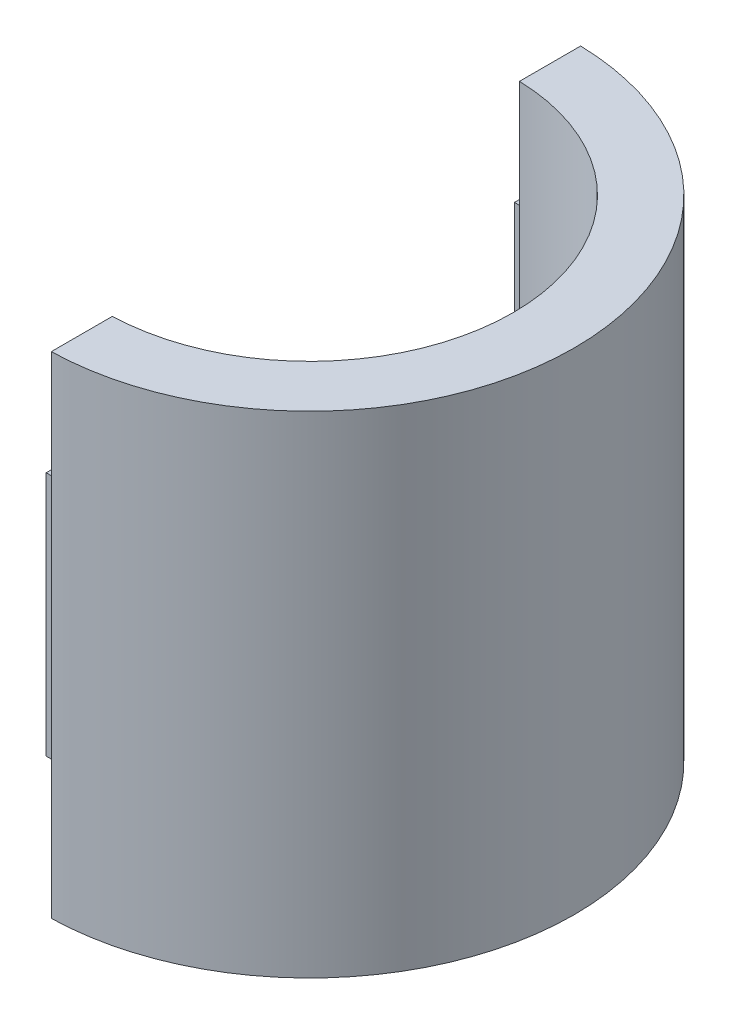
ISO-10303-21;
HEADER;
FILE_DESCRIPTION(('STEP AP214'),'2;1');
FILE_NAME('part.step','',(''),(''),'','','');
FILE_SCHEMA(('AUTOMOTIVE_DESIGN { 1 0 10303 214 1 1 1 1 }'));
ENDSEC;
DATA;
#1=APPLICATION_CONTEXT('core data for automotive mechanical design processes');
#2=APPLICATION_PROTOCOL_DEFINITION('international standard','automotive_design',2000,#1);
#3=PRODUCT_CONTEXT('',#1,'mechanical');
#4=PRODUCT('Part','Part','',(#3));
#5=PRODUCT_RELATED_PRODUCT_CATEGORY('part','',(#4));
#6=PRODUCT_DEFINITION_FORMATION('','',#4);
#7=PRODUCT_DEFINITION_CONTEXT('part definition',#1,'design');
#8=PRODUCT_DEFINITION('design','',#6,#7);
#9=PRODUCT_DEFINITION_SHAPE('','',#8);
#10=(LENGTH_UNIT() NAMED_UNIT(*) SI_UNIT(.MILLI.,.METRE.));
#11=(NAMED_UNIT(*) PLANE_ANGLE_UNIT() SI_UNIT($,.RADIAN.));
#12=(NAMED_UNIT(*) SI_UNIT($,.STERADIAN.) SOLID_ANGLE_UNIT());
#13=UNCERTAINTY_MEASURE_WITH_UNIT(LENGTH_MEASURE(1.E-05),#10,'distance_accuracy_value','');
#14=(GEOMETRIC_REPRESENTATION_CONTEXT(3) GLOBAL_UNCERTAINTY_ASSIGNED_CONTEXT((#13)) GLOBAL_UNIT_ASSIGNED_CONTEXT((#10,
#11,#12)) REPRESENTATION_CONTEXT('',''));
#15=CARTESIAN_POINT('',(0.,0.,0.));
#16=DIRECTION('',(0.,0.,1.));
#17=DIRECTION('',(1.,0.,0.));
#18=AXIS2_PLACEMENT_3D('',#15,#16,#17);
#19=CARTESIAN_POINT('',(3.175,0.,0.));
#20=DIRECTION('',(1.,0.,0.));
#21=DIRECTION('',(0.,0.,-1.));
#22=AXIS2_PLACEMENT_3D('',#19,#20,#21);
#23=PLANE('',#22);
#24=DIRECTION('',(0.,0.,-1.));
#25=VECTOR('',#24,1.);
#26=CARTESIAN_POINT('',(3.175,241.01,0.));
#27=LINE('',#26,#25);
#28=CARTESIAN_POINT('',(3.175,241.01,129.961222581969));
#29=VERTEX_POINT('',#28);
#30=CARTESIAN_POINT('',(3.175,241.01,99.9495841662185));
#31=VERTEX_POINT('',#30);
#32=EDGE_CURVE('E55',#29,#31,#27,.T.);
#33=ORIENTED_EDGE('',*,*,#32,.T.);
#34=DIRECTION('',(0.,1.,0.));
#35=VECTOR('',#34,1.);
#36=CARTESIAN_POINT('',(3.175,0.,99.9495841662185));
#37=LINE('',#36,#35);
#38=CARTESIAN_POINT('',(3.175,0.,99.9495841662185));
#39=VERTEX_POINT('',#38);
#40=EDGE_CURVE('E243',#39,#31,#37,.T.);
#41=ORIENTED_EDGE('',*,*,#40,.F.);
#42=DIRECTION('',(0.,0.,-1.));
#43=VECTOR('',#42,1.);
#44=CARTESIAN_POINT('',(3.175,0.,0.));
#45=LINE('',#44,#43);
#46=CARTESIAN_POINT('',(3.175,0.,129.961222581969));
#47=VERTEX_POINT('',#46);
#48=EDGE_CURVE('E253',#47,#39,#45,.T.);
#49=ORIENTED_EDGE('',*,*,#48,.F.);
#50=DIRECTION('',(0.,-1.,0.));
#51=VECTOR('',#50,1.);
#52=CARTESIAN_POINT('',(3.175,241.01,129.961222581969));
#53=LINE('',#52,#51);
#54=EDGE_CURVE('E255',#29,#47,#53,.T.);
#55=ORIENTED_EDGE('',*,*,#54,.F.);
#56=EDGE_LOOP('',(#33,#41,#49,#55));
#57=FACE_BOUND('',#56,.T.);
#58=DIRECTION('',(0.,-1.,0.));
#59=VECTOR('',#58,1.);
#60=CARTESIAN_POINT('',(3.175,60.2525,107.452493770156));
#61=LINE('',#60,#59);
#62=CARTESIAN_POINT('',(3.175,180.7575,107.452493770156));
#63=VERTEX_POINT('',#62);
#64=CARTESIAN_POINT('',(3.175,60.2525,107.452493770156));
#65=VERTEX_POINT('',#64);
#66=EDGE_CURVE('E170',#63,#65,#61,.T.);
#67=ORIENTED_EDGE('',*,*,#66,.F.);
#68=DIRECTION('',(0.,0.,-1.));
#69=VECTOR('',#68,1.);
#70=CARTESIAN_POINT('',(3.175,180.7575,107.452493770156));
#71=LINE('',#70,#69);
#72=CARTESIAN_POINT('',(3.175,180.7575,122.458312978031));
#73=VERTEX_POINT('',#72);
#74=EDGE_CURVE('E152',#73,#63,#71,.T.);
#75=ORIENTED_EDGE('',*,*,#74,.F.);
#76=DIRECTION('',(0.,1.,0.));
#77=VECTOR('',#76,1.);
#78=CARTESIAN_POINT('',(3.175,60.2525,122.458312978031));
#79=LINE('',#78,#77);
#80=CARTESIAN_POINT('',(3.175,60.2525,122.458312978031));
#81=VERTEX_POINT('',#80);
#82=EDGE_CURVE('E68',#81,#73,#79,.T.);
#83=ORIENTED_EDGE('',*,*,#82,.F.);
#84=DIRECTION('',(0.,0.,1.));
#85=VECTOR('',#84,1.);
#86=CARTESIAN_POINT('',(3.175,60.2525,107.452493770156));
#87=LINE('',#86,#85);
#88=EDGE_CURVE('E63',#65,#81,#87,.T.);
#89=ORIENTED_EDGE('',*,*,#88,.F.);
#90=EDGE_LOOP('',(#67,#75,#83,#89));
#91=FACE_BOUND('',#90,.T.);
#92=ADVANCED_FACE('F45',(#57,#91),#23,.F.);
#93=DIRECTION('',(0.,0.,1.));
#94=VECTOR('',#93,1.);
#95=CARTESIAN_POINT('',(3.175,180.7575,-107.452493770156));
#96=LINE('',#95,#94);
#97=CARTESIAN_POINT('',(3.175,180.7575,-122.458312978031));
#98=VERTEX_POINT('',#97);
#99=CARTESIAN_POINT('',(3.175,180.7575,-107.452493770156));
#100=VERTEX_POINT('',#99);
#101=EDGE_CURVE('E191',#98,#100,#96,.T.);
#102=ORIENTED_EDGE('',*,*,#101,.T.);
#103=DIRECTION('',(0.,-1.,0.));
#104=VECTOR('',#103,1.);
#105=CARTESIAN_POINT('',(3.175,60.2525,-107.452493770156));
#106=LINE('',#105,#104);
#107=CARTESIAN_POINT('',(3.175,60.2525,-107.452493770156));
#108=VERTEX_POINT('',#107);
#109=EDGE_CURVE('E179',#100,#108,#106,.T.);
#110=ORIENTED_EDGE('',*,*,#109,.T.);
#111=DIRECTION('',(0.,0.,-1.));
#112=VECTOR('',#111,1.);
#113=CARTESIAN_POINT('',(3.175,60.2525,-107.452493770156));
#114=LINE('',#113,#112);
#115=CARTESIAN_POINT('',(3.175,60.2525,-122.458312978031));
#116=VERTEX_POINT('',#115);
#117=EDGE_CURVE('E207',#108,#116,#114,.T.);
#118=ORIENTED_EDGE('',*,*,#117,.T.);
#119=DIRECTION('',(0.,1.,0.));
#120=VECTOR('',#119,1.);
#121=CARTESIAN_POINT('',(3.175,60.2525,-122.458312978031));
#122=LINE('',#121,#120);
#123=EDGE_CURVE('E211',#116,#98,#122,.T.);
#124=ORIENTED_EDGE('',*,*,#123,.T.);
#125=EDGE_LOOP('',(#102,#110,#118,#124));
#126=FACE_BOUND('',#125,.T.);
#127=CARTESIAN_POINT('',(3.175,0.,-99.9495841662185));
#128=VERTEX_POINT('',#127);
#129=CARTESIAN_POINT('',(3.175,0.,-129.961222581969));
#130=VERTEX_POINT('',#129);
#131=EDGE_CURVE('E252',#128,#130,#45,.T.);
#132=ORIENTED_EDGE('',*,*,#131,.F.);
#133=DIRECTION('',(0.,1.,0.));
#134=VECTOR('',#133,1.);
#135=CARTESIAN_POINT('',(3.175,0.,-99.9495841662185));
#136=LINE('',#135,#134);
#137=CARTESIAN_POINT('',(3.175,241.01,-99.9495841662185));
#138=VERTEX_POINT('',#137);
#139=EDGE_CURVE('E249',#138,#128,#136,.F.);
#140=ORIENTED_EDGE('',*,*,#139,.F.);
#141=CARTESIAN_POINT('',(3.175,241.01,-129.961222581969));
#142=VERTEX_POINT('',#141);
#143=EDGE_CURVE('E11',#138,#142,#27,.T.);
#144=ORIENTED_EDGE('',*,*,#143,.T.);
#145=DIRECTION('',(0.,-1.,0.));
#146=VECTOR('',#145,1.);
#147=CARTESIAN_POINT('',(3.175,241.01,-129.961222581969));
#148=LINE('',#147,#146);
#149=EDGE_CURVE('E49',#130,#142,#148,.F.);
#150=ORIENTED_EDGE('',*,*,#149,.F.);
#151=EDGE_LOOP('',(#132,#140,#144,#150));
#152=FACE_BOUND('',#151,.T.);
#153=ADVANCED_FACE('F47',(#126,#152),#23,.F.);
#154=CARTESIAN_POINT('',(0.,241.01,0.));
#155=DIRECTION('',(0.,-1.,0.));
#156=DIRECTION('',(0.,0.,-1.));
#157=AXIS2_PLACEMENT_3D('',#154,#155,#156);
#158=CYLINDRICAL_SURFACE('',#157,130.);
#159=CARTESIAN_POINT('',(0.,241.01,0.));
#160=DIRECTION('',(0.,1.,0.));
#161=DIRECTION('',(0.,0.,1.));
#162=AXIS2_PLACEMENT_3D('',#159,#160,#161);
#163=CIRCLE('',#162,130.);
#164=EDGE_CURVE('E239',#29,#142,#163,.T.);
#165=ORIENTED_EDGE('',*,*,#164,.F.);
#166=ORIENTED_EDGE('',*,*,#54,.T.);
#167=CARTESIAN_POINT('',(0.,0.,0.));
#168=DIRECTION('',(0.,1.,0.));
#169=DIRECTION('',(0.,0.,1.));
#170=AXIS2_PLACEMENT_3D('',#167,#168,#169);
#171=CIRCLE('',#170,130.);
#172=EDGE_CURVE('E235',#47,#130,#171,.T.);
#173=ORIENTED_EDGE('',*,*,#172,.T.);
#174=ORIENTED_EDGE('',*,*,#149,.T.);
#175=EDGE_LOOP('',(#165,#166,#173,#174));
#176=FACE_BOUND('',#175,.T.);
#177=ADVANCED_FACE('F263',(#176),#158,.T.);
#178=CARTESIAN_POINT('',(0.,0.,0.));
#179=DIRECTION('',(0.,1.,0.));
#180=DIRECTION('',(0.,0.,1.));
#181=AXIS2_PLACEMENT_3D('',#178,#179,#180);
#182=PLANE('',#181);
#183=ORIENTED_EDGE('',*,*,#172,.F.);
#184=ORIENTED_EDGE('',*,*,#48,.T.);
#185=CARTESIAN_POINT('',(0.,0.,0.));
#186=DIRECTION('',(0.,1.,0.));
#187=DIRECTION('',(0.,0.,1.));
#188=AXIS2_PLACEMENT_3D('',#185,#186,#187);
#189=CIRCLE('',#188,100.);
#190=EDGE_CURVE('E231',#39,#128,#189,.T.);
#191=ORIENTED_EDGE('',*,*,#190,.T.);
#192=ORIENTED_EDGE('',*,*,#131,.T.);
#193=EDGE_LOOP('',(#183,#184,#191,#192));
#194=FACE_BOUND('',#193,.T.);
#195=ADVANCED_FACE('F277',(#194),#182,.F.);
#196=CARTESIAN_POINT('',(0.,241.01,0.));
#197=DIRECTION('',(0.,1.,0.));
#198=DIRECTION('',(0.,0.,1.));
#199=AXIS2_PLACEMENT_3D('',#196,#197,#198);
#200=PLANE('',#199);
#201=ORIENTED_EDGE('',*,*,#32,.F.);
#202=ORIENTED_EDGE('',*,*,#164,.T.);
#203=ORIENTED_EDGE('',*,*,#143,.F.);
#204=CARTESIAN_POINT('',(0.,241.01,0.));
#205=DIRECTION('',(0.,1.,0.));
#206=DIRECTION('',(0.,0.,1.));
#207=AXIS2_PLACEMENT_3D('',#204,#205,#206);
#208=CIRCLE('',#207,100.);
#209=EDGE_CURVE('E221',#31,#138,#208,.T.);
#210=ORIENTED_EDGE('',*,*,#209,.F.);
#211=EDGE_LOOP('',(#201,#202,#203,#210));
#212=FACE_BOUND('',#211,.T.);
#213=ADVANCED_FACE('F272',(#212),#200,.T.);
#214=CARTESIAN_POINT('',(0.,0.,0.));
#215=DIRECTION('',(0.,1.,0.));
#216=DIRECTION('',(0.,0.,1.));
#217=AXIS2_PLACEMENT_3D('',#214,#215,#216);
#218=CYLINDRICAL_SURFACE('',#217,100.);
#219=ORIENTED_EDGE('',*,*,#209,.T.);
#220=ORIENTED_EDGE('',*,*,#139,.T.);
#221=ORIENTED_EDGE('',*,*,#190,.F.);
#222=ORIENTED_EDGE('',*,*,#40,.T.);
#223=EDGE_LOOP('',(#219,#220,#221,#222));
#224=FACE_BOUND('',#223,.T.);
#225=ADVANCED_FACE('F280',(#224),#218,.F.);
#226=CARTESIAN_POINT('',(-6.825,60.2525,-107.452493770156));
#227=DIRECTION('',(0.,0.,1.));
#228=DIRECTION('',(1.,0.,0.));
#229=AXIS2_PLACEMENT_3D('',#226,#227,#228);
#230=PLANE('',#229);
#231=ORIENTED_EDGE('',*,*,#109,.F.);
#232=DIRECTION('',(1.,0.,0.));
#233=VECTOR('',#232,1.);
#234=CARTESIAN_POINT('',(-6.825,180.7575,-107.452493770156));
#235=LINE('',#234,#233);
#236=CARTESIAN_POINT('',(-6.825,180.7575,-107.452493770156));
#237=VERTEX_POINT('',#236);
#238=EDGE_CURVE('E218',#237,#100,#235,.T.);
#239=ORIENTED_EDGE('',*,*,#238,.F.);
#240=DIRECTION('',(0.,-1.,0.));
#241=VECTOR('',#240,1.);
#242=CARTESIAN_POINT('',(-6.825,60.2525,-107.452493770156));
#243=LINE('',#242,#241);
#244=CARTESIAN_POINT('',(-6.825,60.2525,-107.452493770156));
#245=VERTEX_POINT('',#244);
#246=EDGE_CURVE('E186',#237,#245,#243,.T.);
#247=ORIENTED_EDGE('',*,*,#246,.T.);
#248=DIRECTION('',(1.,0.,0.));
#249=VECTOR('',#248,1.);
#250=CARTESIAN_POINT('',(-6.825,60.2525,-107.452493770156));
#251=LINE('',#250,#249);
#252=EDGE_CURVE('E203',#245,#108,#251,.T.);
#253=ORIENTED_EDGE('',*,*,#252,.T.);
#254=EDGE_LOOP('',(#231,#239,#247,#253));
#255=FACE_BOUND('',#254,.T.);
#256=ADVANCED_FACE('F282',(#255),#230,.T.);
#257=CARTESIAN_POINT('',(-6.825,180.7575,-107.452493770156));
#258=DIRECTION('',(0.,1.,0.));
#259=DIRECTION('',(0.,0.,1.));
#260=AXIS2_PLACEMENT_3D('',#257,#258,#259);
#261=PLANE('',#260);
#262=ORIENTED_EDGE('',*,*,#101,.F.);
#263=DIRECTION('',(1.,0.,0.));
#264=VECTOR('',#263,1.);
#265=CARTESIAN_POINT('',(-6.825,180.7575,-122.458312978031));
#266=LINE('',#265,#264);
#267=CARTESIAN_POINT('',(-6.825,180.7575,-122.458312978031));
#268=VERTEX_POINT('',#267);
#269=EDGE_CURVE('E222',#268,#98,#266,.T.);
#270=ORIENTED_EDGE('',*,*,#269,.F.);
#271=DIRECTION('',(0.,0.,1.));
#272=VECTOR('',#271,1.);
#273=CARTESIAN_POINT('',(-6.825,180.7575,-107.452493770156));
#274=LINE('',#273,#272);
#275=EDGE_CURVE('E199',#268,#237,#274,.T.);
#276=ORIENTED_EDGE('',*,*,#275,.T.);
#277=ORIENTED_EDGE('',*,*,#238,.T.);
#278=EDGE_LOOP('',(#262,#270,#276,#277));
#279=FACE_BOUND('',#278,.T.);
#280=ADVANCED_FACE('F290',(#279),#261,.T.);
#281=CARTESIAN_POINT('',(-6.825,60.2525,-122.458312978031));
#282=DIRECTION('',(0.,0.,-1.));
#283=DIRECTION('',(-1.,0.,0.));
#284=AXIS2_PLACEMENT_3D('',#281,#282,#283);
#285=PLANE('',#284);
#286=ORIENTED_EDGE('',*,*,#123,.F.);
#287=DIRECTION('',(1.,0.,0.));
#288=VECTOR('',#287,1.);
#289=CARTESIAN_POINT('',(-6.825,60.2525,-122.458312978031));
#290=LINE('',#289,#288);
#291=CARTESIAN_POINT('',(-6.825,60.2525,-122.458312978031));
#292=VERTEX_POINT('',#291);
#293=EDGE_CURVE('E225',#292,#116,#290,.T.);
#294=ORIENTED_EDGE('',*,*,#293,.F.);
#295=DIRECTION('',(0.,1.,0.));
#296=VECTOR('',#295,1.);
#297=CARTESIAN_POINT('',(-6.825,60.2525,-122.458312978031));
#298=LINE('',#297,#296);
#299=EDGE_CURVE('E195',#292,#268,#298,.T.);
#300=ORIENTED_EDGE('',*,*,#299,.T.);
#301=ORIENTED_EDGE('',*,*,#269,.T.);
#302=EDGE_LOOP('',(#286,#294,#300,#301));
#303=FACE_BOUND('',#302,.T.);
#304=ADVANCED_FACE('F357',(#303),#285,.T.);
#305=CARTESIAN_POINT('',(-6.825,60.2525,-107.452493770156));
#306=DIRECTION('',(0.,-1.,0.));
#307=DIRECTION('',(0.,0.,-1.));
#308=AXIS2_PLACEMENT_3D('',#305,#306,#307);
#309=PLANE('',#308);
#310=ORIENTED_EDGE('',*,*,#117,.F.);
#311=ORIENTED_EDGE('',*,*,#252,.F.);
#312=DIRECTION('',(0.,0.,-1.));
#313=VECTOR('',#312,1.);
#314=CARTESIAN_POINT('',(-6.825,60.2525,-107.452493770156));
#315=LINE('',#314,#313);
#316=EDGE_CURVE('E190',#245,#292,#315,.T.);
#317=ORIENTED_EDGE('',*,*,#316,.T.);
#318=ORIENTED_EDGE('',*,*,#293,.T.);
#319=EDGE_LOOP('',(#310,#311,#317,#318));
#320=FACE_BOUND('',#319,.T.);
#321=ADVANCED_FACE('F353',(#320),#309,.T.);
#322=CARTESIAN_POINT('',(-6.825,0.,0.));
#323=DIRECTION('',(-1.,0.,0.));
#324=DIRECTION('',(0.,0.,1.));
#325=AXIS2_PLACEMENT_3D('',#322,#323,#324);
#326=PLANE('',#325);
#327=ORIENTED_EDGE('',*,*,#246,.F.);
#328=ORIENTED_EDGE('',*,*,#275,.F.);
#329=ORIENTED_EDGE('',*,*,#299,.F.);
#330=ORIENTED_EDGE('',*,*,#316,.F.);
#331=EDGE_LOOP('',(#327,#328,#329,#330));
#332=FACE_BOUND('',#331,.T.);
#333=ADVANCED_FACE('F305',(#332),#326,.T.);
#334=CARTESIAN_POINT('',(-6.825,60.2525,107.452493770156));
#335=DIRECTION('',(0.,0.,1.));
#336=DIRECTION('',(1.,0.,0.));
#337=AXIS2_PLACEMENT_3D('',#334,#335,#336);
#338=PLANE('',#337);
#339=ORIENTED_EDGE('',*,*,#66,.T.);
#340=DIRECTION('',(1.,0.,0.));
#341=VECTOR('',#340,1.);
#342=CARTESIAN_POINT('',(-6.825,60.2525,107.452493770156));
#343=LINE('',#342,#341);
#344=CARTESIAN_POINT('',(-6.825,60.2525,107.452493770156));
#345=VERTEX_POINT('',#344);
#346=EDGE_CURVE('E160',#345,#65,#343,.T.);
#347=ORIENTED_EDGE('',*,*,#346,.F.);
#348=DIRECTION('',(0.,-1.,0.));
#349=VECTOR('',#348,1.);
#350=CARTESIAN_POINT('',(-6.825,60.2525,107.452493770156));
#351=LINE('',#350,#349);
#352=CARTESIAN_POINT('',(-6.825,180.7575,107.452493770156));
#353=VERTEX_POINT('',#352);
#354=EDGE_CURVE('E139',#353,#345,#351,.T.);
#355=ORIENTED_EDGE('',*,*,#354,.F.);
#356=DIRECTION('',(1.,0.,0.));
#357=VECTOR('',#356,1.);
#358=CARTESIAN_POINT('',(-6.825,180.7575,107.452493770156));
#359=LINE('',#358,#357);
#360=EDGE_CURVE('E150',#353,#63,#359,.T.);
#361=ORIENTED_EDGE('',*,*,#360,.T.);
#362=EDGE_LOOP('',(#339,#347,#355,#361));
#363=FACE_BOUND('',#362,.T.);
#364=ADVANCED_FACE('F159',(#363),#338,.F.);
#365=CARTESIAN_POINT('',(-6.825,60.2525,107.452493770156));
#366=DIRECTION('',(0.,1.,0.));
#367=DIRECTION('',(0.,0.,1.));
#368=AXIS2_PLACEMENT_3D('',#365,#366,#367);
#369=PLANE('',#368);
#370=ORIENTED_EDGE('',*,*,#88,.T.);
#371=DIRECTION('',(1.,0.,0.));
#372=VECTOR('',#371,1.);
#373=CARTESIAN_POINT('',(-6.825,60.2525,122.458312978031));
#374=LINE('',#373,#372);
#375=CARTESIAN_POINT('',(-6.825,60.2525,122.458312978031));
#376=VERTEX_POINT('',#375);
#377=EDGE_CURVE('E180',#376,#81,#374,.T.);
#378=ORIENTED_EDGE('',*,*,#377,.F.);
#379=DIRECTION('',(0.,0.,1.));
#380=VECTOR('',#379,1.);
#381=CARTESIAN_POINT('',(-6.825,60.2525,107.452493770156));
#382=LINE('',#381,#380);
#383=EDGE_CURVE('E157',#345,#376,#382,.T.);
#384=ORIENTED_EDGE('',*,*,#383,.F.);
#385=ORIENTED_EDGE('',*,*,#346,.T.);
#386=EDGE_LOOP('',(#370,#378,#384,#385));
#387=FACE_BOUND('',#386,.T.);
#388=ADVANCED_FACE('F312',(#387),#369,.F.);
#389=CARTESIAN_POINT('',(-6.825,60.2525,122.458312978031));
#390=DIRECTION('',(0.,0.,-1.));
#391=DIRECTION('',(-1.,0.,0.));
#392=AXIS2_PLACEMENT_3D('',#389,#390,#391);
#393=PLANE('',#392);
#394=ORIENTED_EDGE('',*,*,#82,.T.);
#395=DIRECTION('',(1.,0.,0.));
#396=VECTOR('',#395,1.);
#397=CARTESIAN_POINT('',(-6.825,180.7575,122.458312978031));
#398=LINE('',#397,#396);
#399=CARTESIAN_POINT('',(-6.825,180.7575,122.458312978031));
#400=VERTEX_POINT('',#399);
#401=EDGE_CURVE('E156',#400,#73,#398,.T.);
#402=ORIENTED_EDGE('',*,*,#401,.F.);
#403=DIRECTION('',(0.,1.,0.));
#404=VECTOR('',#403,1.);
#405=CARTESIAN_POINT('',(-6.825,60.2525,122.458312978031));
#406=LINE('',#405,#404);
#407=EDGE_CURVE('E142',#376,#400,#406,.T.);
#408=ORIENTED_EDGE('',*,*,#407,.F.);
#409=ORIENTED_EDGE('',*,*,#377,.T.);
#410=EDGE_LOOP('',(#394,#402,#408,#409));
#411=FACE_BOUND('',#410,.T.);
#412=ADVANCED_FACE('F319',(#411),#393,.F.);
#413=CARTESIAN_POINT('',(-6.825,180.7575,107.452493770156));
#414=DIRECTION('',(0.,-1.,0.));
#415=DIRECTION('',(0.,0.,-1.));
#416=AXIS2_PLACEMENT_3D('',#413,#414,#415);
#417=PLANE('',#416);
#418=ORIENTED_EDGE('',*,*,#74,.T.);
#419=ORIENTED_EDGE('',*,*,#360,.F.);
#420=DIRECTION('',(0.,0.,-1.));
#421=VECTOR('',#420,1.);
#422=CARTESIAN_POINT('',(-6.825,180.7575,107.452493770156));
#423=LINE('',#422,#421);
#424=EDGE_CURVE('E135',#400,#353,#423,.T.);
#425=ORIENTED_EDGE('',*,*,#424,.F.);
#426=ORIENTED_EDGE('',*,*,#401,.T.);
#427=EDGE_LOOP('',(#418,#419,#425,#426));
#428=FACE_BOUND('',#427,.T.);
#429=ADVANCED_FACE('F151',(#428),#417,.F.);
#430=CARTESIAN_POINT('',(-6.825,0.,0.));
#431=DIRECTION('',(-1.,0.,0.));
#432=DIRECTION('',(0.,0.,-1.));
#433=AXIS2_PLACEMENT_3D('',#430,#431,#432);
#434=PLANE('',#433);
#435=ORIENTED_EDGE('',*,*,#354,.T.);
#436=ORIENTED_EDGE('',*,*,#383,.T.);
#437=ORIENTED_EDGE('',*,*,#407,.T.);
#438=ORIENTED_EDGE('',*,*,#424,.T.);
#439=EDGE_LOOP('',(#435,#436,#437,#438));
#440=FACE_BOUND('',#439,.T.);
#441=ADVANCED_FACE('F137',(#440),#434,.T.);
#442=CLOSED_SHELL('',(#92,#153,#177,#195,#213,#225,#256,#280,#304,#321,#333,#364,#388,#412,#429,#441));
#443=MANIFOLD_SOLID_BREP('B2',#442);
#444=ADVANCED_BREP_SHAPE_REPRESENTATION('',(#18,#443),#14);
#445=SHAPE_DEFINITION_REPRESENTATION(#9,#444);
ENDSEC;
END-ISO-10303-21;
